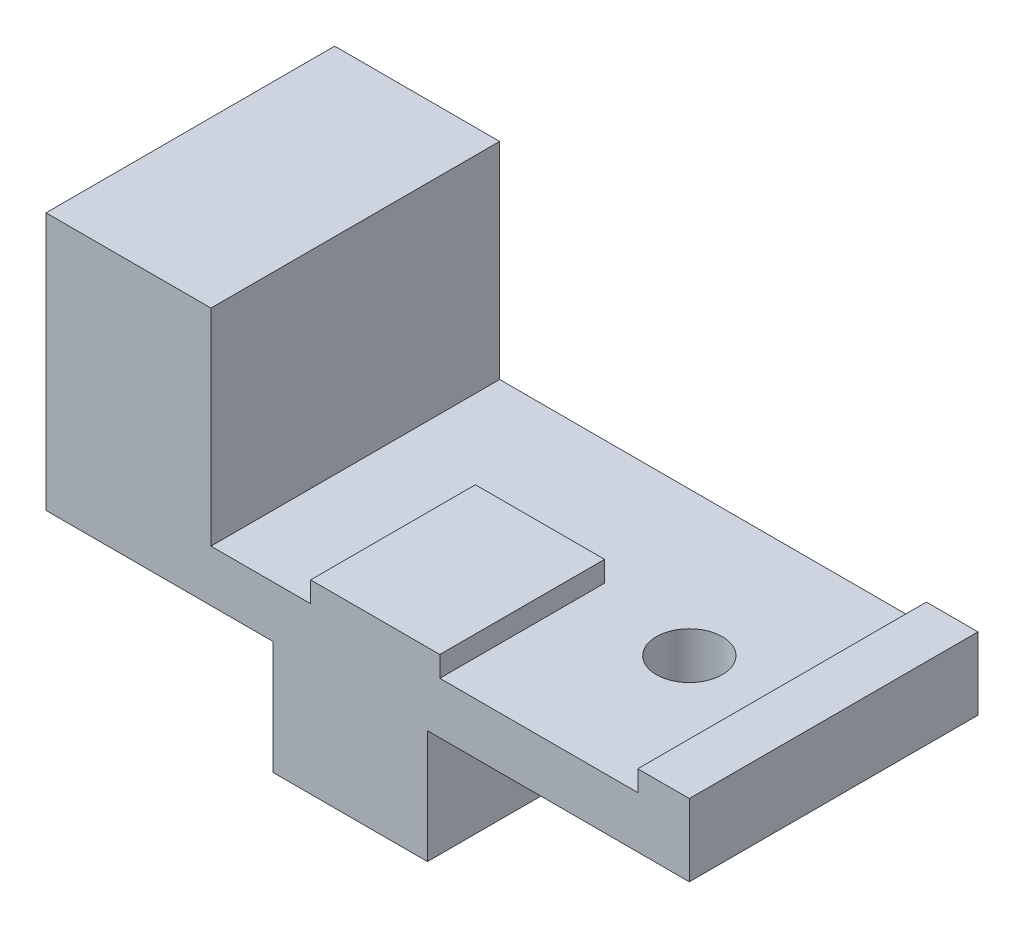
ISO-10303-21;
HEADER;
FILE_DESCRIPTION(('STEP AP214'),'2;1');
FILE_NAME('part.step','',(''),(''),'','','');
FILE_SCHEMA(('AUTOMOTIVE_DESIGN { 1 0 10303 214 1 1 1 1 }'));
ENDSEC;
DATA;
#1=APPLICATION_CONTEXT('core data for automotive mechanical design processes');
#2=APPLICATION_PROTOCOL_DEFINITION('international standard','automotive_design',2000,#1);
#3=PRODUCT_CONTEXT('',#1,'mechanical');
#4=PRODUCT('Part','Part','',(#3));
#5=PRODUCT_RELATED_PRODUCT_CATEGORY('part','',(#4));
#6=PRODUCT_DEFINITION_FORMATION('','',#4);
#7=PRODUCT_DEFINITION_CONTEXT('part definition',#1,'design');
#8=PRODUCT_DEFINITION('design','',#6,#7);
#9=PRODUCT_DEFINITION_SHAPE('','',#8);
#10=(LENGTH_UNIT() NAMED_UNIT(*) SI_UNIT(.MILLI.,.METRE.));
#11=(NAMED_UNIT(*) PLANE_ANGLE_UNIT() SI_UNIT($,.RADIAN.));
#12=(NAMED_UNIT(*) SI_UNIT($,.STERADIAN.) SOLID_ANGLE_UNIT());
#13=UNCERTAINTY_MEASURE_WITH_UNIT(LENGTH_MEASURE(1.E-05),#10,'distance_accuracy_value','');
#14=(GEOMETRIC_REPRESENTATION_CONTEXT(3) GLOBAL_UNCERTAINTY_ASSIGNED_CONTEXT((#13)) GLOBAL_UNIT_ASSIGNED_CONTEXT((#10,
#11,#12)) REPRESENTATION_CONTEXT('',''));
#15=CARTESIAN_POINT('',(0.,0.,0.));
#16=DIRECTION('',(0.,0.,1.));
#17=DIRECTION('',(1.,0.,0.));
#18=AXIS2_PLACEMENT_3D('',#15,#16,#17);
#19=CARTESIAN_POINT('',(0.,2.5,0.));
#20=DIRECTION('',(0.,1.,0.));
#21=DIRECTION('',(0.,0.,1.));
#22=AXIS2_PLACEMENT_3D('',#19,#20,#21);
#23=PLANE('',#22);
#24=DIRECTION('',(0.,0.,-1.));
#25=VECTOR('',#24,1.);
#26=CARTESIAN_POINT('',(13.1,2.5,7.));
#27=LINE('',#26,#25);
#28=CARTESIAN_POINT('',(13.1,2.5,7.));
#29=VERTEX_POINT('',#28);
#30=CARTESIAN_POINT('',(13.1,2.5,-7.));
#31=VERTEX_POINT('',#30);
#32=EDGE_CURVE('E49',#29,#31,#27,.T.);
#33=ORIENTED_EDGE('',*,*,#32,.T.);
#34=DIRECTION('',(-1.,0.,0.));
#35=VECTOR('',#34,1.);
#36=CARTESIAN_POINT('',(-15.6,2.5,-7.));
#37=LINE('',#36,#35);
#38=CARTESIAN_POINT('',(-7.6,2.5,-7.));
#39=VERTEX_POINT('',#38);
#40=EDGE_CURVE('E266',#31,#39,#37,.T.);
#41=ORIENTED_EDGE('',*,*,#40,.T.);
#42=DIRECTION('',(0.,0.,-1.));
#43=VECTOR('',#42,1.);
#44=CARTESIAN_POINT('',(-7.6,2.5,7.));
#45=LINE('',#44,#43);
#46=CARTESIAN_POINT('',(-7.6,2.5,7.));
#47=VERTEX_POINT('',#46);
#48=EDGE_CURVE('E246',#47,#39,#45,.T.);
#49=ORIENTED_EDGE('',*,*,#48,.F.);
#50=DIRECTION('',(1.,0.,0.));
#51=VECTOR('',#50,1.);
#52=CARTESIAN_POINT('',(-15.6,2.5,7.));
#53=LINE('',#52,#51);
#54=CARTESIAN_POINT('',(-2.76665258343201,2.5,7.));
#55=VERTEX_POINT('',#54);
#56=EDGE_CURVE('E158',#47,#55,#53,.T.);
#57=ORIENTED_EDGE('',*,*,#56,.T.);
#58=DIRECTION('',(0.,0.,1.));
#59=VECTOR('',#58,1.);
#60=CARTESIAN_POINT('',(-2.76665258343201,2.5,7.));
#61=LINE('',#60,#59);
#62=CARTESIAN_POINT('',(-2.76665258343201,2.5,-0.991101380179771));
#63=VERTEX_POINT('',#62);
#64=EDGE_CURVE('E186',#63,#55,#61,.T.);
#65=ORIENTED_EDGE('',*,*,#64,.F.);
#66=DIRECTION('',(-1.,0.,0.));
#67=VECTOR('',#66,1.);
#68=CARTESIAN_POINT('',(3.5,2.5,-0.991101380179771));
#69=LINE('',#68,#67);
#70=CARTESIAN_POINT('',(3.5,2.5,-0.991101380179771));
#71=VERTEX_POINT('',#70);
#72=EDGE_CURVE('E195',#71,#63,#69,.T.);
#73=ORIENTED_EDGE('',*,*,#72,.F.);
#74=DIRECTION('',(0.,0.,-1.));
#75=VECTOR('',#74,1.);
#76=CARTESIAN_POINT('',(3.5,2.5,7.));
#77=LINE('',#76,#75);
#78=CARTESIAN_POINT('',(3.5,2.5,7.));
#79=VERTEX_POINT('',#78);
#80=EDGE_CURVE('E180',#79,#71,#77,.T.);
#81=ORIENTED_EDGE('',*,*,#80,.F.);
#82=EDGE_CURVE('E54',#79,#29,#53,.T.);
#83=ORIENTED_EDGE('',*,*,#82,.T.);
#84=EDGE_LOOP('',(#33,#41,#49,#57,#65,#73,#81,#83));
#85=FACE_BOUND('',#84,.T.);
#86=CARTESIAN_POINT('',(8.6,2.5,0.));
#87=DIRECTION('',(0.,1.,0.));
#88=DIRECTION('',(0.,0.,1.));
#89=AXIS2_PLACEMENT_3D('',#86,#87,#88);
#90=CIRCLE('',#89,1.6);
#91=CARTESIAN_POINT('',(8.6,2.5,1.6));
#92=VERTEX_POINT('',#91);
#93=EDGE_CURVE('E211',#92,#92,#90,.T.);
#94=ORIENTED_EDGE('',*,*,#93,.F.);
#95=EDGE_LOOP('',(#94));
#96=FACE_BOUND('',#95,.T.);
#97=ADVANCED_FACE('F34',(#85,#96),#23,.T.);
#98=CARTESIAN_POINT('',(0.,0.,0.));
#99=DIRECTION('',(0.,1.,0.));
#100=DIRECTION('',(0.,0.,1.));
#101=AXIS2_PLACEMENT_3D('',#98,#99,#100);
#102=PLANE('',#101);
#103=CARTESIAN_POINT('',(8.6,0.,0.));
#104=DIRECTION('',(0.,1.,0.));
#105=DIRECTION('',(0.,0.,1.));
#106=AXIS2_PLACEMENT_3D('',#103,#104,#105);
#107=CIRCLE('',#106,1.6);
#108=CARTESIAN_POINT('',(8.6,0.,1.6));
#109=VERTEX_POINT('',#108);
#110=EDGE_CURVE('E214',#109,#109,#107,.T.);
#111=ORIENTED_EDGE('',*,*,#110,.T.);
#112=EDGE_LOOP('',(#111));
#113=FACE_BOUND('',#112,.T.);
#114=DIRECTION('',(0.,0.,-1.));
#115=VECTOR('',#114,1.);
#116=CARTESIAN_POINT('',(-4.6,0.,7.));
#117=LINE('',#116,#115);
#118=CARTESIAN_POINT('',(-4.6,0.,7.));
#119=VERTEX_POINT('',#118);
#120=CARTESIAN_POINT('',(-4.6,0.,-0.499999999999999));
#121=VERTEX_POINT('',#120);
#122=EDGE_CURVE('E217',#119,#121,#117,.T.);
#123=ORIENTED_EDGE('',*,*,#122,.F.);
#124=DIRECTION('',(1.,0.,0.));
#125=VECTOR('',#124,1.);
#126=CARTESIAN_POINT('',(-15.6,0.,7.));
#127=LINE('',#126,#125);
#128=CARTESIAN_POINT('',(-15.6,0.,7.));
#129=VERTEX_POINT('',#128);
#130=EDGE_CURVE('E268',#129,#119,#127,.T.);
#131=ORIENTED_EDGE('',*,*,#130,.F.);
#132=DIRECTION('',(0.,0.,1.));
#133=VECTOR('',#132,1.);
#134=CARTESIAN_POINT('',(-15.6,0.,-7.));
#135=LINE('',#134,#133);
#136=CARTESIAN_POINT('',(-15.6,0.,-7.));
#137=VERTEX_POINT('',#136);
#138=EDGE_CURVE('E273',#137,#129,#135,.T.);
#139=ORIENTED_EDGE('',*,*,#138,.F.);
#140=DIRECTION('',(-1.,0.,0.));
#141=VECTOR('',#140,1.);
#142=CARTESIAN_POINT('',(-15.6,0.,-7.));
#143=LINE('',#142,#141);
#144=CARTESIAN_POINT('',(15.6,0.,-7.));
#145=VERTEX_POINT('',#144);
#146=EDGE_CURVE('E271',#145,#137,#143,.T.);
#147=ORIENTED_EDGE('',*,*,#146,.F.);
#148=DIRECTION('',(0.,0.,-1.));
#149=VECTOR('',#148,1.);
#150=CARTESIAN_POINT('',(15.6,0.,-7.));
#151=LINE('',#150,#149);
#152=CARTESIAN_POINT('',(15.6,0.,7.));
#153=VERTEX_POINT('',#152);
#154=EDGE_CURVE('E265',#153,#145,#151,.T.);
#155=ORIENTED_EDGE('',*,*,#154,.F.);
#156=CARTESIAN_POINT('',(2.9,0.,7.));
#157=VERTEX_POINT('',#156);
#158=EDGE_CURVE('E152',#157,#153,#127,.T.);
#159=ORIENTED_EDGE('',*,*,#158,.F.);
#160=DIRECTION('',(0.,0.,1.));
#161=VECTOR('',#160,1.);
#162=CARTESIAN_POINT('',(2.9,0.,7.));
#163=LINE('',#162,#161);
#164=CARTESIAN_POINT('',(2.9,0.,-0.499999999999999));
#165=VERTEX_POINT('',#164);
#166=EDGE_CURVE('E222',#165,#157,#163,.T.);
#167=ORIENTED_EDGE('',*,*,#166,.F.);
#168=DIRECTION('',(1.,0.,0.));
#169=VECTOR('',#168,1.);
#170=CARTESIAN_POINT('',(-4.6,0.,-0.499999999999999));
#171=LINE('',#170,#169);
#172=EDGE_CURVE('E231',#121,#165,#171,.T.);
#173=ORIENTED_EDGE('',*,*,#172,.F.);
#174=EDGE_LOOP('',(#123,#131,#139,#147,#155,#159,#167,#173));
#175=FACE_BOUND('',#174,.T.);
#176=ADVANCED_FACE('F286',(#113,#175),#102,.F.);
#177=CARTESIAN_POINT('',(15.6,2.5,-7.));
#178=DIRECTION('',(-1.,0.,0.));
#179=DIRECTION('',(0.,0.,1.));
#180=AXIS2_PLACEMENT_3D('',#177,#178,#179);
#181=PLANE('',#180);
#182=ORIENTED_EDGE('',*,*,#154,.T.);
#183=DIRECTION('',(0.,-1.,0.));
#184=VECTOR('',#183,1.);
#185=CARTESIAN_POINT('',(15.6,2.5,-7.));
#186=LINE('',#185,#184);
#187=CARTESIAN_POINT('',(15.6,3.5,-7.));
#188=VERTEX_POINT('',#187);
#189=EDGE_CURVE('E11',#188,#145,#186,.T.);
#190=ORIENTED_EDGE('',*,*,#189,.F.);
#191=DIRECTION('',(0.,0.,1.));
#192=VECTOR('',#191,1.);
#193=CARTESIAN_POINT('',(15.6,3.5,7.));
#194=LINE('',#193,#192);
#195=CARTESIAN_POINT('',(15.6,3.5,7.));
#196=VERTEX_POINT('',#195);
#197=EDGE_CURVE('E165',#188,#196,#194,.T.);
#198=ORIENTED_EDGE('',*,*,#197,.T.);
#199=DIRECTION('',(0.,-1.,0.));
#200=VECTOR('',#199,1.);
#201=CARTESIAN_POINT('',(15.6,2.5,7.));
#202=LINE('',#201,#200);
#203=EDGE_CURVE('E146',#196,#153,#202,.T.);
#204=ORIENTED_EDGE('',*,*,#203,.T.);
#205=EDGE_LOOP('',(#182,#190,#198,#204));
#206=FACE_BOUND('',#205,.T.);
#207=ADVANCED_FACE('F36',(#206),#181,.F.);
#208=CARTESIAN_POINT('',(-15.6,2.5,-7.));
#209=DIRECTION('',(0.,0.,1.));
#210=DIRECTION('',(1.,0.,0.));
#211=AXIS2_PLACEMENT_3D('',#208,#209,#210);
#212=PLANE('',#211);
#213=ORIENTED_EDGE('',*,*,#146,.T.);
#214=DIRECTION('',(0.,-1.,0.));
#215=VECTOR('',#214,1.);
#216=CARTESIAN_POINT('',(-15.6,2.5,-7.));
#217=LINE('',#216,#215);
#218=CARTESIAN_POINT('',(-15.6,12.5,-7.));
#219=VERTEX_POINT('',#218);
#220=EDGE_CURVE('E42',#219,#137,#217,.T.);
#221=ORIENTED_EDGE('',*,*,#220,.F.);
#222=DIRECTION('',(-1.,0.,0.));
#223=VECTOR('',#222,1.);
#224=CARTESIAN_POINT('',(-15.6,12.5,-7.));
#225=LINE('',#224,#223);
#226=CARTESIAN_POINT('',(-7.6,12.5,-7.));
#227=VERTEX_POINT('',#226);
#228=EDGE_CURVE('E254',#227,#219,#225,.T.);
#229=ORIENTED_EDGE('',*,*,#228,.F.);
#230=DIRECTION('',(0.,-1.,0.));
#231=VECTOR('',#230,1.);
#232=CARTESIAN_POINT('',(-7.6,12.5,-7.));
#233=LINE('',#232,#231);
#234=EDGE_CURVE('E257',#227,#39,#233,.T.);
#235=ORIENTED_EDGE('',*,*,#234,.T.);
#236=ORIENTED_EDGE('',*,*,#40,.F.);
#237=DIRECTION('',(0.,-1.,0.));
#238=VECTOR('',#237,1.);
#239=CARTESIAN_POINT('',(13.1,3.5,-7.));
#240=LINE('',#239,#238);
#241=CARTESIAN_POINT('',(13.1,3.5,-7.));
#242=VERTEX_POINT('',#241);
#243=EDGE_CURVE('E177',#242,#31,#240,.T.);
#244=ORIENTED_EDGE('',*,*,#243,.F.);
#245=DIRECTION('',(1.,0.,0.));
#246=VECTOR('',#245,1.);
#247=CARTESIAN_POINT('',(15.6,3.5,-7.));
#248=LINE('',#247,#246);
#249=EDGE_CURVE('E174',#242,#188,#248,.T.);
#250=ORIENTED_EDGE('',*,*,#249,.T.);
#251=ORIENTED_EDGE('',*,*,#189,.T.);
#252=EDGE_LOOP('',(#213,#221,#229,#235,#236,#244,#250,#251));
#253=FACE_BOUND('',#252,.T.);
#254=ADVANCED_FACE('F327',(#253),#212,.F.);
#255=CARTESIAN_POINT('',(-15.6,2.5,-7.));
#256=DIRECTION('',(1.,0.,0.));
#257=DIRECTION('',(0.,0.,-1.));
#258=AXIS2_PLACEMENT_3D('',#255,#256,#257);
#259=PLANE('',#258);
#260=ORIENTED_EDGE('',*,*,#138,.T.);
#261=DIRECTION('',(0.,-1.,0.));
#262=VECTOR('',#261,1.);
#263=CARTESIAN_POINT('',(-15.6,2.5,7.));
#264=LINE('',#263,#262);
#265=CARTESIAN_POINT('',(-15.6,12.5,7.));
#266=VERTEX_POINT('',#265);
#267=EDGE_CURVE('E157',#266,#129,#264,.T.);
#268=ORIENTED_EDGE('',*,*,#267,.F.);
#269=DIRECTION('',(0.,0.,1.));
#270=VECTOR('',#269,1.);
#271=CARTESIAN_POINT('',(-15.6,12.5,7.));
#272=LINE('',#271,#270);
#273=EDGE_CURVE('E247',#219,#266,#272,.T.);
#274=ORIENTED_EDGE('',*,*,#273,.F.);
#275=ORIENTED_EDGE('',*,*,#220,.T.);
#276=EDGE_LOOP('',(#260,#268,#274,#275));
#277=FACE_BOUND('',#276,.T.);
#278=ADVANCED_FACE('F281',(#277),#259,.F.);
#279=CARTESIAN_POINT('',(-15.6,2.5,7.));
#280=DIRECTION('',(0.,0.,-1.));
#281=DIRECTION('',(-1.,0.,0.));
#282=AXIS2_PLACEMENT_3D('',#279,#280,#281);
#283=PLANE('',#282);
#284=ORIENTED_EDGE('',*,*,#130,.T.);
#285=DIRECTION('',(0.,1.,0.));
#286=VECTOR('',#285,1.);
#287=CARTESIAN_POINT('',(-4.6,-5.5,7.));
#288=LINE('',#287,#286);
#289=CARTESIAN_POINT('',(-4.6,-5.5,7.));
#290=VERTEX_POINT('',#289);
#291=EDGE_CURVE('E228',#290,#119,#288,.T.);
#292=ORIENTED_EDGE('',*,*,#291,.F.);
#293=DIRECTION('',(-1.,0.,0.));
#294=VECTOR('',#293,1.);
#295=CARTESIAN_POINT('',(-4.6,-5.5,7.));
#296=LINE('',#295,#294);
#297=CARTESIAN_POINT('',(2.9,-5.5,7.));
#298=VERTEX_POINT('',#297);
#299=EDGE_CURVE('E226',#298,#290,#296,.T.);
#300=ORIENTED_EDGE('',*,*,#299,.F.);
#301=DIRECTION('',(0.,1.,0.));
#302=VECTOR('',#301,1.);
#303=CARTESIAN_POINT('',(2.9,-5.5,7.));
#304=LINE('',#303,#302);
#305=EDGE_CURVE('E238',#298,#157,#304,.T.);
#306=ORIENTED_EDGE('',*,*,#305,.T.);
#307=ORIENTED_EDGE('',*,*,#158,.T.);
#308=ORIENTED_EDGE('',*,*,#203,.F.);
#309=DIRECTION('',(-1.,0.,0.));
#310=VECTOR('',#309,1.);
#311=CARTESIAN_POINT('',(15.6,3.5,7.));
#312=LINE('',#311,#310);
#313=CARTESIAN_POINT('',(13.1,3.5,7.));
#314=VERTEX_POINT('',#313);
#315=EDGE_CURVE('E150',#196,#314,#312,.T.);
#316=ORIENTED_EDGE('',*,*,#315,.T.);
#317=DIRECTION('',(0.,-1.,0.));
#318=VECTOR('',#317,1.);
#319=CARTESIAN_POINT('',(13.1,3.5,7.));
#320=LINE('',#319,#318);
#321=EDGE_CURVE('E175',#314,#29,#320,.T.);
#322=ORIENTED_EDGE('',*,*,#321,.T.);
#323=ORIENTED_EDGE('',*,*,#82,.F.);
#324=DIRECTION('',(0.,-1.,0.));
#325=VECTOR('',#324,1.);
#326=CARTESIAN_POINT('',(3.5,3.5,7.));
#327=LINE('',#326,#325);
#328=CARTESIAN_POINT('',(3.5,3.5,7.));
#329=VERTEX_POINT('',#328);
#330=EDGE_CURVE('E192',#329,#79,#327,.T.);
#331=ORIENTED_EDGE('',*,*,#330,.F.);
#332=DIRECTION('',(1.,0.,0.));
#333=VECTOR('',#332,1.);
#334=CARTESIAN_POINT('',(3.5,3.5,7.));
#335=LINE('',#334,#333);
#336=CARTESIAN_POINT('',(-2.76665258343201,3.5,7.));
#337=VERTEX_POINT('',#336);
#338=EDGE_CURVE('E190',#337,#329,#335,.T.);
#339=ORIENTED_EDGE('',*,*,#338,.F.);
#340=DIRECTION('',(0.,-1.,0.));
#341=VECTOR('',#340,1.);
#342=CARTESIAN_POINT('',(-2.76665258343201,3.5,7.));
#343=LINE('',#342,#341);
#344=EDGE_CURVE('E202',#337,#55,#343,.T.);
#345=ORIENTED_EDGE('',*,*,#344,.T.);
#346=ORIENTED_EDGE('',*,*,#56,.F.);
#347=DIRECTION('',(0.,-1.,0.));
#348=VECTOR('',#347,1.);
#349=CARTESIAN_POINT('',(-7.6,12.5,7.));
#350=LINE('',#349,#348);
#351=CARTESIAN_POINT('',(-7.6,12.5,7.));
#352=VERTEX_POINT('',#351);
#353=EDGE_CURVE('E262',#352,#47,#350,.T.);
#354=ORIENTED_EDGE('',*,*,#353,.F.);
#355=DIRECTION('',(1.,0.,0.));
#356=VECTOR('',#355,1.);
#357=CARTESIAN_POINT('',(-15.6,12.5,7.));
#358=LINE('',#357,#356);
#359=EDGE_CURVE('E250',#266,#352,#358,.T.);
#360=ORIENTED_EDGE('',*,*,#359,.F.);
#361=ORIENTED_EDGE('',*,*,#267,.T.);
#362=EDGE_LOOP('',(#284,#292,#300,#306,#307,#308,#316,#322,#323,#331,#339,#345,#346,#354,#360,#361));
#363=FACE_BOUND('',#362,.T.);
#364=ADVANCED_FACE('F149',(#363),#283,.F.);
#365=CARTESIAN_POINT('',(-7.6,12.5,7.));
#366=DIRECTION('',(-1.,0.,0.));
#367=DIRECTION('',(0.,0.,1.));
#368=AXIS2_PLACEMENT_3D('',#365,#366,#367);
#369=PLANE('',#368);
#370=ORIENTED_EDGE('',*,*,#48,.T.);
#371=ORIENTED_EDGE('',*,*,#234,.F.);
#372=DIRECTION('',(0.,0.,-1.));
#373=VECTOR('',#372,1.);
#374=CARTESIAN_POINT('',(-7.6,12.5,7.));
#375=LINE('',#374,#373);
#376=EDGE_CURVE('E252',#352,#227,#375,.T.);
#377=ORIENTED_EDGE('',*,*,#376,.F.);
#378=ORIENTED_EDGE('',*,*,#353,.T.);
#379=EDGE_LOOP('',(#370,#371,#377,#378));
#380=FACE_BOUND('',#379,.T.);
#381=ADVANCED_FACE('F321',(#380),#369,.F.);
#382=CARTESIAN_POINT('',(0.,12.5,0.));
#383=DIRECTION('',(0.,-1.,0.));
#384=DIRECTION('',(0.,0.,-1.));
#385=AXIS2_PLACEMENT_3D('',#382,#383,#384);
#386=PLANE('',#385);
#387=ORIENTED_EDGE('',*,*,#273,.T.);
#388=ORIENTED_EDGE('',*,*,#359,.T.);
#389=ORIENTED_EDGE('',*,*,#376,.T.);
#390=ORIENTED_EDGE('',*,*,#228,.T.);
#391=EDGE_LOOP('',(#387,#388,#389,#390));
#392=FACE_BOUND('',#391,.T.);
#393=ADVANCED_FACE('F310',(#392),#386,.F.);
#394=CARTESIAN_POINT('',(-4.6,-5.5,7.));
#395=DIRECTION('',(1.,0.,0.));
#396=DIRECTION('',(0.,0.,-1.));
#397=AXIS2_PLACEMENT_3D('',#394,#395,#396);
#398=PLANE('',#397);
#399=ORIENTED_EDGE('',*,*,#122,.T.);
#400=DIRECTION('',(0.,1.,0.));
#401=VECTOR('',#400,1.);
#402=CARTESIAN_POINT('',(-4.6,-5.5,-0.499999999999999));
#403=LINE('',#402,#401);
#404=CARTESIAN_POINT('',(-4.6,-5.5,-0.499999999999999));
#405=VERTEX_POINT('',#404);
#406=EDGE_CURVE('E243',#405,#121,#403,.T.);
#407=ORIENTED_EDGE('',*,*,#406,.F.);
#408=DIRECTION('',(0.,0.,-1.));
#409=VECTOR('',#408,1.);
#410=CARTESIAN_POINT('',(-4.6,-5.5,7.));
#411=LINE('',#410,#409);
#412=EDGE_CURVE('E218',#290,#405,#411,.T.);
#413=ORIENTED_EDGE('',*,*,#412,.F.);
#414=ORIENTED_EDGE('',*,*,#291,.T.);
#415=EDGE_LOOP('',(#399,#407,#413,#414));
#416=FACE_BOUND('',#415,.T.);
#417=ADVANCED_FACE('F292',(#416),#398,.F.);
#418=CARTESIAN_POINT('',(-4.6,-5.5,-0.499999999999999));
#419=DIRECTION('',(0.,0.,1.));
#420=DIRECTION('',(1.,0.,0.));
#421=AXIS2_PLACEMENT_3D('',#418,#419,#420);
#422=PLANE('',#421);
#423=ORIENTED_EDGE('',*,*,#172,.T.);
#424=DIRECTION('',(0.,1.,0.));
#425=VECTOR('',#424,1.);
#426=CARTESIAN_POINT('',(2.9,-5.5,-0.499999999999999));
#427=LINE('',#426,#425);
#428=CARTESIAN_POINT('',(2.9,-5.5,-0.499999999999999));
#429=VERTEX_POINT('',#428);
#430=EDGE_CURVE('E240',#429,#165,#427,.T.);
#431=ORIENTED_EDGE('',*,*,#430,.F.);
#432=DIRECTION('',(1.,0.,0.));
#433=VECTOR('',#432,1.);
#434=CARTESIAN_POINT('',(-4.6,-5.5,-0.499999999999999));
#435=LINE('',#434,#433);
#436=EDGE_CURVE('E221',#405,#429,#435,.T.);
#437=ORIENTED_EDGE('',*,*,#436,.F.);
#438=ORIENTED_EDGE('',*,*,#406,.T.);
#439=EDGE_LOOP('',(#423,#431,#437,#438));
#440=FACE_BOUND('',#439,.T.);
#441=ADVANCED_FACE('F302',(#440),#422,.F.);
#442=CARTESIAN_POINT('',(2.9,-5.5,7.));
#443=DIRECTION('',(-1.,0.,0.));
#444=DIRECTION('',(0.,0.,1.));
#445=AXIS2_PLACEMENT_3D('',#442,#443,#444);
#446=PLANE('',#445);
#447=ORIENTED_EDGE('',*,*,#166,.T.);
#448=ORIENTED_EDGE('',*,*,#305,.F.);
#449=DIRECTION('',(0.,0.,1.));
#450=VECTOR('',#449,1.);
#451=CARTESIAN_POINT('',(2.9,-5.5,7.));
#452=LINE('',#451,#450);
#453=EDGE_CURVE('E224',#429,#298,#452,.T.);
#454=ORIENTED_EDGE('',*,*,#453,.F.);
#455=ORIENTED_EDGE('',*,*,#430,.T.);
#456=EDGE_LOOP('',(#447,#448,#454,#455));
#457=FACE_BOUND('',#456,.T.);
#458=ADVANCED_FACE('F300',(#457),#446,.F.);
#459=CARTESIAN_POINT('',(0.,-5.5,0.));
#460=DIRECTION('',(0.,-1.,0.));
#461=DIRECTION('',(0.,0.,-1.));
#462=AXIS2_PLACEMENT_3D('',#459,#460,#461);
#463=PLANE('',#462);
#464=ORIENTED_EDGE('',*,*,#412,.T.);
#465=ORIENTED_EDGE('',*,*,#436,.T.);
#466=ORIENTED_EDGE('',*,*,#453,.T.);
#467=ORIENTED_EDGE('',*,*,#299,.T.);
#468=EDGE_LOOP('',(#464,#465,#466,#467));
#469=FACE_BOUND('',#468,.T.);
#470=ADVANCED_FACE('F295',(#469),#463,.T.);
#471=CARTESIAN_POINT('',(8.6,2.5,0.));
#472=DIRECTION('',(0.,1.,0.));
#473=DIRECTION('',(0.,0.,1.));
#474=AXIS2_PLACEMENT_3D('',#471,#472,#473);
#475=CYLINDRICAL_SURFACE('',#474,1.6);
#476=ORIENTED_EDGE('',*,*,#110,.F.);
#477=EDGE_LOOP('',(#476));
#478=FACE_BOUND('',#477,.T.);
#479=ORIENTED_EDGE('',*,*,#93,.T.);
#480=EDGE_LOOP('',(#479));
#481=FACE_BOUND('',#480,.T.);
#482=ADVANCED_FACE('F358',(#478,#481),#475,.F.);
#483=CARTESIAN_POINT('',(3.5,3.5,7.));
#484=DIRECTION('',(-1.,0.,0.));
#485=DIRECTION('',(0.,0.,1.));
#486=AXIS2_PLACEMENT_3D('',#483,#484,#485);
#487=PLANE('',#486);
#488=ORIENTED_EDGE('',*,*,#80,.T.);
#489=DIRECTION('',(0.,-1.,0.));
#490=VECTOR('',#489,1.);
#491=CARTESIAN_POINT('',(3.5,3.5,-0.991101380179771));
#492=LINE('',#491,#490);
#493=CARTESIAN_POINT('',(3.5,3.5,-0.991101380179771));
#494=VERTEX_POINT('',#493);
#495=EDGE_CURVE('E208',#494,#71,#492,.T.);
#496=ORIENTED_EDGE('',*,*,#495,.F.);
#497=DIRECTION('',(0.,0.,-1.));
#498=VECTOR('',#497,1.);
#499=CARTESIAN_POINT('',(3.5,3.5,7.));
#500=LINE('',#499,#498);
#501=EDGE_CURVE('E182',#329,#494,#500,.T.);
#502=ORIENTED_EDGE('',*,*,#501,.F.);
#503=ORIENTED_EDGE('',*,*,#330,.T.);
#504=EDGE_LOOP('',(#488,#496,#502,#503));
#505=FACE_BOUND('',#504,.T.);
#506=ADVANCED_FACE('F339',(#505),#487,.F.);
#507=CARTESIAN_POINT('',(3.5,3.5,-0.991101380179771));
#508=DIRECTION('',(0.,0.,1.));
#509=DIRECTION('',(1.,0.,0.));
#510=AXIS2_PLACEMENT_3D('',#507,#508,#509);
#511=PLANE('',#510);
#512=ORIENTED_EDGE('',*,*,#72,.T.);
#513=DIRECTION('',(0.,-1.,0.));
#514=VECTOR('',#513,1.);
#515=CARTESIAN_POINT('',(-2.76665258343201,3.5,-0.991101380179771));
#516=LINE('',#515,#514);
#517=CARTESIAN_POINT('',(-2.76665258343201,3.5,-0.991101380179771));
#518=VERTEX_POINT('',#517);
#519=EDGE_CURVE('E205',#518,#63,#516,.T.);
#520=ORIENTED_EDGE('',*,*,#519,.F.);
#521=DIRECTION('',(-1.,0.,0.));
#522=VECTOR('',#521,1.);
#523=CARTESIAN_POINT('',(3.5,3.5,-0.991101380179771));
#524=LINE('',#523,#522);
#525=EDGE_CURVE('E185',#494,#518,#524,.T.);
#526=ORIENTED_EDGE('',*,*,#525,.F.);
#527=ORIENTED_EDGE('',*,*,#495,.T.);
#528=EDGE_LOOP('',(#512,#520,#526,#527));
#529=FACE_BOUND('',#528,.T.);
#530=ADVANCED_FACE('F350',(#529),#511,.F.);
#531=CARTESIAN_POINT('',(-2.76665258343201,3.5,7.));
#532=DIRECTION('',(1.,0.,0.));
#533=DIRECTION('',(0.,0.,-1.));
#534=AXIS2_PLACEMENT_3D('',#531,#532,#533);
#535=PLANE('',#534);
#536=ORIENTED_EDGE('',*,*,#64,.T.);
#537=ORIENTED_EDGE('',*,*,#344,.F.);
#538=DIRECTION('',(0.,0.,1.));
#539=VECTOR('',#538,1.);
#540=CARTESIAN_POINT('',(-2.76665258343201,3.5,7.));
#541=LINE('',#540,#539);
#542=EDGE_CURVE('E188',#518,#337,#541,.T.);
#543=ORIENTED_EDGE('',*,*,#542,.F.);
#544=ORIENTED_EDGE('',*,*,#519,.T.);
#545=EDGE_LOOP('',(#536,#537,#543,#544));
#546=FACE_BOUND('',#545,.T.);
#547=ADVANCED_FACE('F348',(#546),#535,.F.);
#548=CARTESIAN_POINT('',(0.,3.5,0.));
#549=DIRECTION('',(0.,1.,0.));
#550=DIRECTION('',(0.,0.,1.));
#551=AXIS2_PLACEMENT_3D('',#548,#549,#550);
#552=PLANE('',#551);
#553=ORIENTED_EDGE('',*,*,#501,.T.);
#554=ORIENTED_EDGE('',*,*,#525,.T.);
#555=ORIENTED_EDGE('',*,*,#542,.T.);
#556=ORIENTED_EDGE('',*,*,#338,.T.);
#557=EDGE_LOOP('',(#553,#554,#555,#556));
#558=FACE_BOUND('',#557,.T.);
#559=ADVANCED_FACE('F341',(#558),#552,.T.);
#560=CARTESIAN_POINT('',(13.1,3.5,7.));
#561=DIRECTION('',(-1.,0.,0.));
#562=DIRECTION('',(0.,0.,1.));
#563=AXIS2_PLACEMENT_3D('',#560,#561,#562);
#564=PLANE('',#563);
#565=ORIENTED_EDGE('',*,*,#32,.F.);
#566=ORIENTED_EDGE('',*,*,#321,.F.);
#567=DIRECTION('',(0.,0.,-1.));
#568=VECTOR('',#567,1.);
#569=CARTESIAN_POINT('',(13.1,3.5,7.));
#570=LINE('',#569,#568);
#571=EDGE_CURVE('E168',#314,#242,#570,.T.);
#572=ORIENTED_EDGE('',*,*,#571,.T.);
#573=ORIENTED_EDGE('',*,*,#243,.T.);
#574=EDGE_LOOP('',(#565,#566,#572,#573));
#575=FACE_BOUND('',#574,.T.);
#576=ADVANCED_FACE('F333',(#575),#564,.T.);
#577=CARTESIAN_POINT('',(0.,3.5,0.));
#578=DIRECTION('',(0.,1.,0.));
#579=DIRECTION('',(0.,0.,1.));
#580=AXIS2_PLACEMENT_3D('',#577,#578,#579);
#581=PLANE('',#580);
#582=ORIENTED_EDGE('',*,*,#197,.F.);
#583=ORIENTED_EDGE('',*,*,#249,.F.);
#584=ORIENTED_EDGE('',*,*,#571,.F.);
#585=ORIENTED_EDGE('',*,*,#315,.F.);
#586=EDGE_LOOP('',(#582,#583,#584,#585));
#587=FACE_BOUND('',#586,.T.);
#588=ADVANCED_FACE('F163',(#587),#581,.T.);
#589=CLOSED_SHELL('',(#97,#176,#207,#254,#278,#364,#381,#393,#417,#441,#458,#470,#482,#506,#530,
#547,#559,#576,#588));
#590=MANIFOLD_SOLID_BREP('B2',#589);
#591=ADVANCED_BREP_SHAPE_REPRESENTATION('',(#18,#590),#14);
#592=SHAPE_DEFINITION_REPRESENTATION(#9,#591);
ENDSEC;
END-ISO-10303-21;
